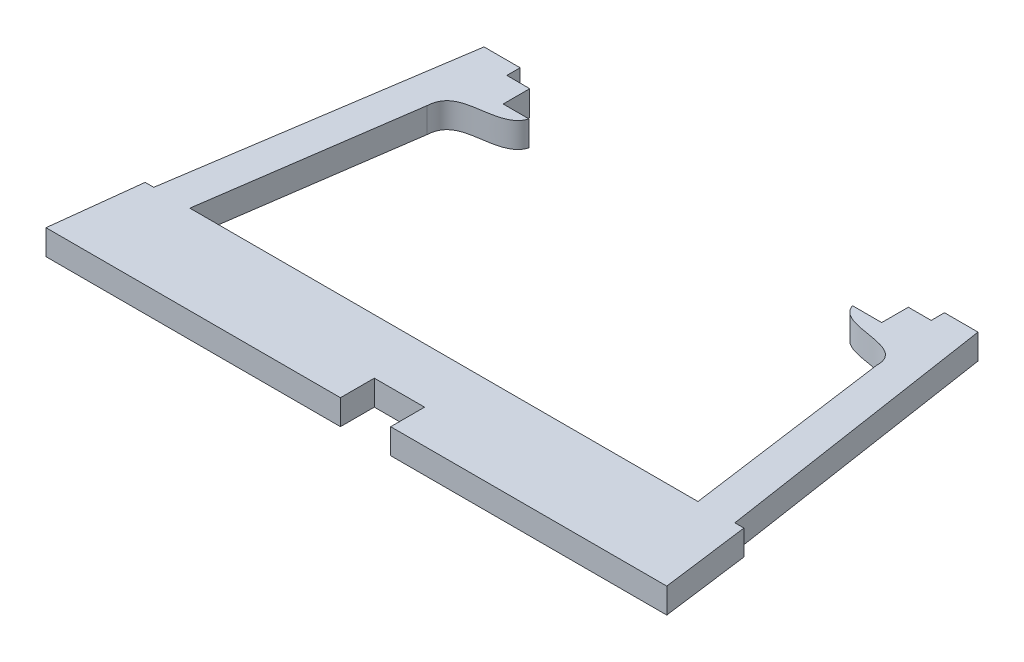
ISO-10303-21;
HEADER;
FILE_DESCRIPTION(('STEP AP214'),'2;1');
FILE_NAME('part.step','',(''),(''),'','','');
FILE_SCHEMA(('AUTOMOTIVE_DESIGN { 1 0 10303 214 1 1 1 1 }'));
ENDSEC;
DATA;
#1=APPLICATION_CONTEXT('core data for automotive mechanical design processes');
#2=APPLICATION_PROTOCOL_DEFINITION('international standard','automotive_design',2000,#1);
#3=PRODUCT_CONTEXT('',#1,'mechanical');
#4=PRODUCT('Part','Part','',(#3));
#5=PRODUCT_RELATED_PRODUCT_CATEGORY('part','',(#4));
#6=PRODUCT_DEFINITION_FORMATION('','',#4);
#7=PRODUCT_DEFINITION_CONTEXT('part definition',#1,'design');
#8=PRODUCT_DEFINITION('design','',#6,#7);
#9=PRODUCT_DEFINITION_SHAPE('','',#8);
#10=(LENGTH_UNIT() NAMED_UNIT(*) SI_UNIT(.MILLI.,.METRE.));
#11=(NAMED_UNIT(*) PLANE_ANGLE_UNIT() SI_UNIT($,.RADIAN.));
#12=(NAMED_UNIT(*) SI_UNIT($,.STERADIAN.) SOLID_ANGLE_UNIT());
#13=UNCERTAINTY_MEASURE_WITH_UNIT(LENGTH_MEASURE(1.E-05),#10,'distance_accuracy_value','');
#14=(GEOMETRIC_REPRESENTATION_CONTEXT(3) GLOBAL_UNCERTAINTY_ASSIGNED_CONTEXT((#13)) GLOBAL_UNIT_ASSIGNED_CONTEXT((#10,
#11,#12)) REPRESENTATION_CONTEXT('',''));
#15=CARTESIAN_POINT('',(0.,0.,0.));
#16=DIRECTION('',(0.,0.,1.));
#17=DIRECTION('',(1.,0.,0.));
#18=AXIS2_PLACEMENT_3D('',#15,#16,#17);
#19=CARTESIAN_POINT('',(-49.4040288484607,4.,126.0149070855));
#20=DIRECTION('',(0.,0.,-1.));
#21=DIRECTION('',(-1.,0.,0.));
#22=AXIS2_PLACEMENT_3D('',#19,#20,#21);
#23=PLANE('',#22);
#24=DIRECTION('',(1.,0.,0.));
#25=VECTOR('',#24,1.);
#26=CARTESIAN_POINT('',(-49.4040288484607,0.,126.0149070855));
#27=LINE('',#26,#25);
#28=CARTESIAN_POINT('',(-93.3560291051147,0.,126.0149070855));
#29=VERTEX_POINT('',#28);
#30=CARTESIAN_POINT('',(-49.4040288484607,0.,126.0149070855));
#31=VERTEX_POINT('',#30);
#32=EDGE_CURVE('E245',#29,#31,#27,.T.);
#33=ORIENTED_EDGE('',*,*,#32,.T.);
#34=DIRECTION('',(0.,-1.,0.));
#35=VECTOR('',#34,1.);
#36=CARTESIAN_POINT('',(-49.4040288484607,4.,126.0149070855));
#37=LINE('',#36,#35);
#38=CARTESIAN_POINT('',(-49.4040288484607,4.,126.0149070855));
#39=VERTEX_POINT('',#38);
#40=EDGE_CURVE('E11',#39,#31,#37,.T.);
#41=ORIENTED_EDGE('',*,*,#40,.F.);
#42=DIRECTION('',(1.,0.,0.));
#43=VECTOR('',#42,1.);
#44=CARTESIAN_POINT('',(-49.4040288484607,4.,126.0149070855));
#45=LINE('',#44,#43);
#46=CARTESIAN_POINT('',(-93.3560291051147,4.,126.0149070855));
#47=VERTEX_POINT('',#46);
#48=EDGE_CURVE('E305',#47,#39,#45,.T.);
#49=ORIENTED_EDGE('',*,*,#48,.F.);
#50=DIRECTION('',(0.,-1.,0.));
#51=VECTOR('',#50,1.);
#52=CARTESIAN_POINT('',(-93.3560291051147,4.,126.0149070855));
#53=LINE('',#52,#51);
#54=EDGE_CURVE('E241',#47,#29,#53,.T.);
#55=ORIENTED_EDGE('',*,*,#54,.T.);
#56=EDGE_LOOP('',(#33,#41,#49,#55));
#57=FACE_BOUND('',#56,.T.);
#58=ADVANCED_FACE('F41',(#57),#23,.F.);
#59=CARTESIAN_POINT('',(-49.4040288484607,4.,126.0149070855));
#60=DIRECTION('',(-0.991434076940235,0.,0.130608081992133));
#61=DIRECTION('',(0.130608081992133,0.,0.991434076940235));
#62=AXIS2_PLACEMENT_3D('',#59,#60,#61);
#63=PLANE('',#62);
#64=DIRECTION('',(-0.130608081992133,0.,-0.991434076940235));
#65=VECTOR('',#64,1.);
#66=CARTESIAN_POINT('',(-49.4040288484607,0.,126.0149070855));
#67=LINE('',#66,#65);
#68=CARTESIAN_POINT('',(-51.2673625897512,0.,111.870510049341));
#69=VERTEX_POINT('',#68);
#70=EDGE_CURVE('E248',#31,#69,#67,.T.);
#71=ORIENTED_EDGE('',*,*,#70,.T.);
#72=DIRECTION('',(0.,-1.,0.));
#73=VECTOR('',#72,1.);
#74=CARTESIAN_POINT('',(-51.2673625897512,4.,111.870510049341));
#75=LINE('',#74,#73);
#76=CARTESIAN_POINT('',(-51.2673625897512,4.,111.870510049341));
#77=VERTEX_POINT('',#76);
#78=EDGE_CURVE('E49',#77,#69,#75,.T.);
#79=ORIENTED_EDGE('',*,*,#78,.F.);
#80=DIRECTION('',(-0.130608081992133,0.,-0.991434076940235));
#81=VECTOR('',#80,1.);
#82=CARTESIAN_POINT('',(-49.4040288484607,4.,126.0149070855));
#83=LINE('',#82,#81);
#84=EDGE_CURVE('E154',#39,#77,#83,.T.);
#85=ORIENTED_EDGE('',*,*,#84,.F.);
#86=ORIENTED_EDGE('',*,*,#40,.T.);
#87=EDGE_LOOP('',(#71,#79,#85,#86));
#88=FACE_BOUND('',#87,.T.);
#89=ADVANCED_FACE('F443',(#88),#63,.F.);
#90=CARTESIAN_POINT('',(-51.2673625897512,4.,111.870510049341));
#91=DIRECTION('',(0.,0.,1.));
#92=DIRECTION('',(1.,0.,0.));
#93=AXIS2_PLACEMENT_3D('',#90,#91,#92);
#94=PLANE('',#93);
#95=DIRECTION('',(-1.,0.,0.));
#96=VECTOR('',#95,1.);
#97=CARTESIAN_POINT('',(-51.2673625897512,0.,111.870510049341));
#98=LINE('',#97,#96);
#99=CARTESIAN_POINT('',(-52.7072113898393,0.,111.870510049341));
#100=VERTEX_POINT('',#99);
#101=EDGE_CURVE('E250',#69,#100,#98,.T.);
#102=ORIENTED_EDGE('',*,*,#101,.T.);
#103=DIRECTION('',(0.,-1.,0.));
#104=VECTOR('',#103,1.);
#105=CARTESIAN_POINT('',(-52.7072113898393,4.,111.870510049341));
#106=LINE('',#105,#104);
#107=CARTESIAN_POINT('',(-52.7072113898393,4.,111.870510049341));
#108=VERTEX_POINT('',#107);
#109=EDGE_CURVE('E366',#108,#100,#106,.T.);
#110=ORIENTED_EDGE('',*,*,#109,.F.);
#111=DIRECTION('',(-1.,0.,0.));
#112=VECTOR('',#111,1.);
#113=CARTESIAN_POINT('',(-51.2673625897512,4.,111.870510049341));
#114=LINE('',#113,#112);
#115=EDGE_CURVE('E374',#77,#108,#114,.T.);
#116=ORIENTED_EDGE('',*,*,#115,.F.);
#117=ORIENTED_EDGE('',*,*,#78,.T.);
#118=EDGE_LOOP('',(#102,#110,#116,#117));
#119=FACE_BOUND('',#118,.T.);
#120=ADVANCED_FACE('F372',(#119),#94,.F.);
#121=CARTESIAN_POINT('',(-52.7072113898393,4.,111.870510049341));
#122=DIRECTION('',(-0.988624766956108,0.,0.150403025770695));
#123=DIRECTION('',(0.150403025770695,0.,0.988624766956108));
#124=AXIS2_PLACEMENT_3D('',#121,#122,#123);
#125=PLANE('',#124);
#126=DIRECTION('',(-0.150403025770695,0.,-0.988624766956108));
#127=VECTOR('',#126,1.);
#128=CARTESIAN_POINT('',(-52.7072113898393,0.,111.870510049341));
#129=LINE('',#128,#127);
#130=CARTESIAN_POINT('',(-59.6523644255584,0.,66.2188333877263));
#131=VERTEX_POINT('',#130);
#132=EDGE_CURVE('E252',#100,#131,#129,.T.);
#133=ORIENTED_EDGE('',*,*,#132,.T.);
#134=DIRECTION('',(0.,-1.,0.));
#135=VECTOR('',#134,1.);
#136=CARTESIAN_POINT('',(-59.6523644255584,4.,66.2188333877263));
#137=LINE('',#136,#135);
#138=CARTESIAN_POINT('',(-59.6523644255584,4.,66.2188333877263));
#139=VERTEX_POINT('',#138);
#140=EDGE_CURVE('E363',#139,#131,#137,.T.);
#141=ORIENTED_EDGE('',*,*,#140,.F.);
#142=DIRECTION('',(-0.150403025770695,0.,-0.988624766956108));
#143=VECTOR('',#142,1.);
#144=CARTESIAN_POINT('',(-52.7072113898393,4.,111.870510049341));
#145=LINE('',#144,#143);
#146=EDGE_CURVE('E392',#108,#139,#145,.T.);
#147=ORIENTED_EDGE('',*,*,#146,.F.);
#148=ORIENTED_EDGE('',*,*,#109,.T.);
#149=EDGE_LOOP('',(#133,#141,#147,#148));
#150=FACE_BOUND('',#149,.T.);
#151=ADVANCED_FACE('F383',(#150),#125,.F.);
#152=CARTESIAN_POINT('',(-59.6523644255584,4.,66.2188333877263));
#153=DIRECTION('',(0.,0.,1.));
#154=DIRECTION('',(1.,0.,0.));
#155=AXIS2_PLACEMENT_3D('',#152,#153,#154);
#156=PLANE('',#155);
#157=DIRECTION('',(-1.,0.,0.));
#158=VECTOR('',#157,1.);
#159=CARTESIAN_POINT('',(-59.6523644255584,0.,66.2188333877263));
#160=LINE('',#159,#158);
#161=CARTESIAN_POINT('',(-64.9882746847082,0.,66.2188333877263));
#162=VERTEX_POINT('',#161);
#163=EDGE_CURVE('E254',#131,#162,#160,.T.);
#164=ORIENTED_EDGE('',*,*,#163,.T.);
#165=DIRECTION('',(0.,-1.,0.));
#166=VECTOR('',#165,1.);
#167=CARTESIAN_POINT('',(-64.9882746847082,4.,66.2188333877263));
#168=LINE('',#167,#166);
#169=CARTESIAN_POINT('',(-64.9882746847082,4.,66.2188333877263));
#170=VERTEX_POINT('',#169);
#171=EDGE_CURVE('E360',#170,#162,#168,.T.);
#172=ORIENTED_EDGE('',*,*,#171,.F.);
#173=DIRECTION('',(-1.,0.,0.));
#174=VECTOR('',#173,1.);
#175=CARTESIAN_POINT('',(-59.6523644255584,4.,66.2188333877263));
#176=LINE('',#175,#174);
#177=EDGE_CURVE('E389',#139,#170,#176,.T.);
#178=ORIENTED_EDGE('',*,*,#177,.F.);
#179=ORIENTED_EDGE('',*,*,#140,.T.);
#180=EDGE_LOOP('',(#164,#172,#178,#179));
#181=FACE_BOUND('',#180,.T.);
#182=ADVANCED_FACE('F387',(#181),#156,.F.);
#183=CARTESIAN_POINT('',(-64.9882746847082,4.,66.2188333877263));
#184=DIRECTION('',(1.,0.,0.));
#185=DIRECTION('',(0.,0.,-1.));
#186=AXIS2_PLACEMENT_3D('',#183,#184,#185);
#187=PLANE('',#186);
#188=DIRECTION('',(0.,0.,1.));
#189=VECTOR('',#188,1.);
#190=CARTESIAN_POINT('',(-64.9882746847082,0.,66.2188333877263));
#191=LINE('',#190,#189);
#192=CARTESIAN_POINT('',(-64.9882746847082,0.,68.3362580937382));
#193=VERTEX_POINT('',#192);
#194=EDGE_CURVE('E256',#162,#193,#191,.T.);
#195=ORIENTED_EDGE('',*,*,#194,.T.);
#196=DIRECTION('',(0.,-1.,0.));
#197=VECTOR('',#196,1.);
#198=CARTESIAN_POINT('',(-64.9882746847082,4.,68.3362580937382));
#199=LINE('',#198,#197);
#200=CARTESIAN_POINT('',(-64.9882746847082,4.,68.3362580937382));
#201=VERTEX_POINT('',#200);
#202=EDGE_CURVE('E357',#201,#193,#199,.T.);
#203=ORIENTED_EDGE('',*,*,#202,.F.);
#204=DIRECTION('',(0.,0.,1.));
#205=VECTOR('',#204,1.);
#206=CARTESIAN_POINT('',(-64.9882746847082,4.,66.2188333877263));
#207=LINE('',#206,#205);
#208=EDGE_CURVE('E391',#170,#201,#207,.T.);
#209=ORIENTED_EDGE('',*,*,#208,.F.);
#210=ORIENTED_EDGE('',*,*,#171,.T.);
#211=EDGE_LOOP('',(#195,#203,#209,#210));
#212=FACE_BOUND('',#211,.T.);
#213=ADVANCED_FACE('F433',(#212),#187,.F.);
#214=CARTESIAN_POINT('',(-64.9882746847082,4.,68.3362580937382));
#215=DIRECTION('',(0.,0.,1.));
#216=DIRECTION('',(1.,0.,0.));
#217=AXIS2_PLACEMENT_3D('',#214,#215,#216);
#218=PLANE('',#217);
#219=DIRECTION('',(-1.,0.,0.));
#220=VECTOR('',#219,1.);
#221=CARTESIAN_POINT('',(-64.9882746847082,0.,68.3362580937382));
#222=LINE('',#221,#220);
#223=CARTESIAN_POINT('',(-68.6302451790486,0.,68.3362580937382));
#224=VERTEX_POINT('',#223);
#225=EDGE_CURVE('E258',#193,#224,#222,.T.);
#226=ORIENTED_EDGE('',*,*,#225,.T.);
#227=DIRECTION('',(0.,-1.,0.));
#228=VECTOR('',#227,1.);
#229=CARTESIAN_POINT('',(-68.6302451790486,4.,68.3362580937382));
#230=LINE('',#229,#228);
#231=CARTESIAN_POINT('',(-68.6302451790486,4.,68.3362580937382));
#232=VERTEX_POINT('',#231);
#233=EDGE_CURVE('E354',#232,#224,#230,.T.);
#234=ORIENTED_EDGE('',*,*,#233,.F.);
#235=DIRECTION('',(-1.,0.,0.));
#236=VECTOR('',#235,1.);
#237=CARTESIAN_POINT('',(-64.9882746847082,4.,68.3362580937382));
#238=LINE('',#237,#236);
#239=EDGE_CURVE('E394',#201,#232,#238,.T.);
#240=ORIENTED_EDGE('',*,*,#239,.F.);
#241=ORIENTED_EDGE('',*,*,#202,.T.);
#242=EDGE_LOOP('',(#226,#234,#240,#241));
#243=FACE_BOUND('',#242,.T.);
#244=ADVANCED_FACE('F429',(#243),#218,.F.);
#245=CARTESIAN_POINT('',(-68.6302451790486,4.,68.3362580937382));
#246=DIRECTION('',(1.,0.,0.));
#247=DIRECTION('',(0.,0.,-1.));
#248=AXIS2_PLACEMENT_3D('',#245,#246,#247);
#249=PLANE('',#248);
#250=DIRECTION('',(0.,0.,1.));
#251=VECTOR('',#250,1.);
#252=CARTESIAN_POINT('',(-68.6302451790486,0.,68.3362580937382));
#253=LINE('',#252,#251);
#254=CARTESIAN_POINT('',(-68.6302451790485,0.,72.5711075057618));
#255=VERTEX_POINT('',#254);
#256=EDGE_CURVE('E260',#224,#255,#253,.T.);
#257=ORIENTED_EDGE('',*,*,#256,.T.);
#258=DIRECTION('',(0.,-1.,0.));
#259=VECTOR('',#258,1.);
#260=CARTESIAN_POINT('',(-68.6302451790485,4.,72.5711075057618));
#261=LINE('',#260,#259);
#262=CARTESIAN_POINT('',(-68.6302451790485,4.,72.5711075057618));
#263=VERTEX_POINT('',#262);
#264=EDGE_CURVE('E351',#263,#255,#261,.T.);
#265=ORIENTED_EDGE('',*,*,#264,.F.);
#266=DIRECTION('',(0.,0.,1.));
#267=VECTOR('',#266,1.);
#268=CARTESIAN_POINT('',(-68.6302451790486,4.,68.3362580937382));
#269=LINE('',#268,#267);
#270=EDGE_CURVE('E400',#232,#263,#269,.T.);
#271=ORIENTED_EDGE('',*,*,#270,.F.);
#272=ORIENTED_EDGE('',*,*,#233,.T.);
#273=EDGE_LOOP('',(#257,#265,#271,#272));
#274=FACE_BOUND('',#273,.T.);
#275=ADVANCED_FACE('F425',(#274),#249,.F.);
#276=CARTESIAN_POINT('',(-68.6302451790485,4.,72.5711075057618));
#277=DIRECTION('',(0.,0.,1.));
#278=DIRECTION('',(1.,0.,0.));
#279=AXIS2_PLACEMENT_3D('',#276,#277,#278);
#280=PLANE('',#279);
#281=DIRECTION('',(-1.,0.,0.));
#282=VECTOR('',#281,1.);
#283=CARTESIAN_POINT('',(-68.6302451790485,0.,72.5711075057618));
#284=LINE('',#283,#282);
#285=CARTESIAN_POINT('',(-73.2885795322746,0.,72.5711075057619));
#286=VERTEX_POINT('',#285);
#287=EDGE_CURVE('E262',#255,#286,#284,.T.);
#288=ORIENTED_EDGE('',*,*,#287,.T.);
#289=DIRECTION('',(0.,-1.,0.));
#290=VECTOR('',#289,1.);
#291=CARTESIAN_POINT('',(-73.2885795322746,4.,72.5711075057619));
#292=LINE('',#291,#290);
#293=CARTESIAN_POINT('',(-73.2885795322746,4.,72.5711075057619));
#294=VERTEX_POINT('',#293);
#295=EDGE_CURVE('E348',#294,#286,#292,.T.);
#296=ORIENTED_EDGE('',*,*,#295,.F.);
#297=DIRECTION('',(-1.,0.,0.));
#298=VECTOR('',#297,1.);
#299=CARTESIAN_POINT('',(-68.6302451790485,4.,72.5711075057618));
#300=LINE('',#299,#298);
#301=EDGE_CURVE('E402',#263,#294,#300,.T.);
#302=ORIENTED_EDGE('',*,*,#301,.F.);
#303=ORIENTED_EDGE('',*,*,#264,.T.);
#304=EDGE_LOOP('',(#288,#296,#302,#303));
#305=FACE_BOUND('',#304,.T.);
#306=ADVANCED_FACE('F420',(#305),#280,.F.);
#307=CARTESIAN_POINT('',(-73.2885795322746,4.,72.5711075057619));
#308=CARTESIAN_POINT('',(-71.9075257445116,4.,76.7032181711937));
#309=CARTESIAN_POINT('',(-62.9924358682695,4.,73.6628925614563));
#310=CARTESIAN_POINT('',(-63.1433697668413,4.,78.8627978108118));
#311=B_SPLINE_CURVE_WITH_KNOTS('',3,(#307,#308,#309,#310),.UNSPECIFIED.,.F.,.F.,(4,4),(0.,1.),.UNSPECIFIED.);
#312=DIRECTION('',(0.,-1.,0.));
#313=VECTOR('',#312,1.);
#314=SURFACE_OF_LINEAR_EXTRUSION('',#311,#313);
#315=CARTESIAN_POINT('',(-73.2885795322746,0.,72.5711075057619));
#316=CARTESIAN_POINT('',(-71.9075257445116,0.,76.7032181711937));
#317=CARTESIAN_POINT('',(-62.9924358682695,0.,73.6628925614563));
#318=CARTESIAN_POINT('',(-63.1433697668413,0.,78.8627978108118));
#319=B_SPLINE_CURVE_WITH_KNOTS('',3,(#315,#316,#317,#318),.UNSPECIFIED.,.F.,.F.,(4,4),(0.,1.),.UNSPECIFIED.);
#320=CARTESIAN_POINT('',(-63.1433697668413,0.,78.8627978108118));
#321=VERTEX_POINT('',#320);
#322=EDGE_CURVE('E264',#286,#321,#319,.T.);
#323=ORIENTED_EDGE('',*,*,#322,.T.);
#324=DIRECTION('',(0.,-1.,0.));
#325=VECTOR('',#324,1.);
#326=CARTESIAN_POINT('',(-63.1433697668413,4.,78.8627978108118));
#327=LINE('',#326,#325);
#328=CARTESIAN_POINT('',(-63.1433697668413,4.,78.8627978108118));
#329=VERTEX_POINT('',#328);
#330=EDGE_CURVE('E345',#329,#321,#327,.T.);
#331=ORIENTED_EDGE('',*,*,#330,.F.);
#332=EDGE_CURVE('E404',#294,#329,#311,.T.);
#333=ORIENTED_EDGE('',*,*,#332,.F.);
#334=ORIENTED_EDGE('',*,*,#295,.T.);
#335=EDGE_LOOP('',(#323,#331,#333,#334));
#336=FACE_BOUND('',#335,.T.);
#337=ADVANCED_FACE('F415',(#336),#314,.F.);
#338=CARTESIAN_POINT('',(-58.58338655225,4.,111.870510049341));
#339=DIRECTION('',(0.990591878074108,0.,-0.136849300669063));
#340=DIRECTION('',(-0.136849300669063,0.,-0.990591878074108));
#341=AXIS2_PLACEMENT_3D('',#338,#339,#340);
#342=PLANE('',#341);
#343=DIRECTION('',(0.136849300669063,0.,0.990591878074108));
#344=VECTOR('',#343,1.);
#345=CARTESIAN_POINT('',(-58.58338655225,0.,111.870510049341));
#346=LINE('',#345,#344);
#347=CARTESIAN_POINT('',(-58.58338655225,0.,111.870510049341));
#348=VERTEX_POINT('',#347);
#349=EDGE_CURVE('E268',#321,#348,#346,.T.);
#350=ORIENTED_EDGE('',*,*,#349,.T.);
#351=DIRECTION('',(0.,-1.,0.));
#352=VECTOR('',#351,1.);
#353=CARTESIAN_POINT('',(-58.58338655225,4.,111.870510049341));
#354=LINE('',#353,#352);
#355=CARTESIAN_POINT('',(-58.58338655225,4.,111.870510049341));
#356=VERTEX_POINT('',#355);
#357=EDGE_CURVE('E342',#356,#348,#354,.T.);
#358=ORIENTED_EDGE('',*,*,#357,.F.);
#359=DIRECTION('',(0.136849300669063,0.,0.990591878074108));
#360=VECTOR('',#359,1.);
#361=CARTESIAN_POINT('',(-58.58338655225,4.,111.870510049341));
#362=LINE('',#361,#360);
#363=EDGE_CURVE('E409',#329,#356,#362,.T.);
#364=ORIENTED_EDGE('',*,*,#363,.F.);
#365=ORIENTED_EDGE('',*,*,#330,.T.);
#366=EDGE_LOOP('',(#350,#358,#364,#365));
#367=FACE_BOUND('',#366,.T.);
#368=ADVANCED_FACE('F419',(#367),#342,.F.);
#369=CARTESIAN_POINT('',(-139.477488779097,4.,111.870510049342));
#370=DIRECTION('',(0.,0.,1.));
#371=DIRECTION('',(1.,0.,0.));
#372=AXIS2_PLACEMENT_3D('',#369,#370,#371);
#373=PLANE('',#372);
#374=DIRECTION('',(-1.,0.,0.));
#375=VECTOR('',#374,1.);
#376=CARTESIAN_POINT('',(-139.477488779097,0.,111.870510049342));
#377=LINE('',#376,#375);
#378=CARTESIAN_POINT('',(-139.477488779097,0.,111.870510049342));
#379=VERTEX_POINT('',#378);
#380=EDGE_CURVE('E273',#348,#379,#377,.T.);
#381=ORIENTED_EDGE('',*,*,#380,.T.);
#382=DIRECTION('',(0.,-1.,0.));
#383=VECTOR('',#382,1.);
#384=CARTESIAN_POINT('',(-139.477488779097,4.,111.870510049342));
#385=LINE('',#384,#383);
#386=CARTESIAN_POINT('',(-139.477488779097,4.,111.870510049342));
#387=VERTEX_POINT('',#386);
#388=EDGE_CURVE('E339',#387,#379,#385,.T.);
#389=ORIENTED_EDGE('',*,*,#388,.F.);
#390=DIRECTION('',(-1.,0.,0.));
#391=VECTOR('',#390,1.);
#392=CARTESIAN_POINT('',(-139.477488779097,4.,111.870510049342));
#393=LINE('',#392,#391);
#394=EDGE_CURVE('E519',#356,#387,#393,.T.);
#395=ORIENTED_EDGE('',*,*,#394,.F.);
#396=ORIENTED_EDGE('',*,*,#357,.T.);
#397=EDGE_LOOP('',(#381,#389,#395,#396));
#398=FACE_BOUND('',#397,.T.);
#399=ADVANCED_FACE('F518',(#398),#373,.F.);
#400=CARTESIAN_POINT('',(-134.735106235922,4.,78.8627978108123));
#401=DIRECTION('',(-0.989835841721892,0.,-0.142214649184649));
#402=DIRECTION('',(-0.142214649184649,0.,0.989835841721892));
#403=AXIS2_PLACEMENT_3D('',#400,#401,#402);
#404=PLANE('',#403);
#405=DIRECTION('',(0.142214649184649,0.,-0.989835841721892));
#406=VECTOR('',#405,1.);
#407=CARTESIAN_POINT('',(-134.735106235922,0.,78.8627978108123));
#408=LINE('',#407,#406);
#409=CARTESIAN_POINT('',(-134.735106235922,0.,78.8627978108123));
#410=VERTEX_POINT('',#409);
#411=EDGE_CURVE('E275',#379,#410,#408,.T.);
#412=ORIENTED_EDGE('',*,*,#411,.T.);
#413=DIRECTION('',(0.,-1.,0.));
#414=VECTOR('',#413,1.);
#415=CARTESIAN_POINT('',(-134.735106235922,4.,78.8627978108123));
#416=LINE('',#415,#414);
#417=CARTESIAN_POINT('',(-134.735106235922,4.,78.8627978108123));
#418=VERTEX_POINT('',#417);
#419=EDGE_CURVE('E336',#418,#410,#416,.T.);
#420=ORIENTED_EDGE('',*,*,#419,.F.);
#421=DIRECTION('',(0.142214649184649,0.,-0.989835841721892));
#422=VECTOR('',#421,1.);
#423=CARTESIAN_POINT('',(-134.735106235922,4.,78.8627978108123));
#424=LINE('',#423,#422);
#425=EDGE_CURVE('E514',#387,#418,#424,.T.);
#426=ORIENTED_EDGE('',*,*,#425,.F.);
#427=ORIENTED_EDGE('',*,*,#388,.T.);
#428=EDGE_LOOP('',(#412,#420,#426,#427));
#429=FACE_BOUND('',#428,.T.);
#430=ADVANCED_FACE('F513',(#429),#404,.F.);
#431=CARTESIAN_POINT('',(-134.735106235922,4.,78.8627978108123));
#432=CARTESIAN_POINT('',(-134.529259995621,4.,75.5671750362815));
#433=CARTESIAN_POINT('',(-129.876755781231,4.,75.4777609406573));
#434=CARTESIAN_POINT('',(-125.277958036841,4.,74.2327659482103));
#435=CARTESIAN_POINT('',(-124.794342828113,4.,72.5711075057622));
#436=B_SPLINE_CURVE_WITH_KNOTS('',3,(#431,#432,#433,#434,#435),.UNSPECIFIED.,.F.,.F.,(4,1,4),
(0.,0.60727925442209,1.),.UNSPECIFIED.);
#437=DIRECTION('',(0.,-1.,0.));
#438=VECTOR('',#437,1.);
#439=SURFACE_OF_LINEAR_EXTRUSION('',#436,#438);
#440=CARTESIAN_POINT('',(-134.735106235922,0.,78.8627978108123));
#441=CARTESIAN_POINT('',(-134.529259995621,0.,75.5671750362815));
#442=CARTESIAN_POINT('',(-129.876755781231,0.,75.4777609406573));
#443=CARTESIAN_POINT('',(-125.277958036841,0.,74.2327659482103));
#444=CARTESIAN_POINT('',(-124.794342828113,0.,72.5711075057622));
#445=B_SPLINE_CURVE_WITH_KNOTS('',3,(#440,#441,#442,#443,#444),.UNSPECIFIED.,.F.,.F.,(4,1,4),
(0.,0.60727925442209,1.),.UNSPECIFIED.);
#446=CARTESIAN_POINT('',(-124.794342828113,0.,72.5711075057622));
#447=VERTEX_POINT('',#446);
#448=EDGE_CURVE('E277',#410,#447,#445,.T.);
#449=ORIENTED_EDGE('',*,*,#448,.T.);
#450=DIRECTION('',(0.,-1.,0.));
#451=VECTOR('',#450,1.);
#452=CARTESIAN_POINT('',(-124.794342828113,4.,72.5711075057622));
#453=LINE('',#452,#451);
#454=CARTESIAN_POINT('',(-124.794342828113,4.,72.5711075057622));
#455=VERTEX_POINT('',#454);
#456=EDGE_CURVE('E333',#455,#447,#453,.T.);
#457=ORIENTED_EDGE('',*,*,#456,.F.);
#458=EDGE_CURVE('E510',#418,#455,#436,.T.);
#459=ORIENTED_EDGE('',*,*,#458,.F.);
#460=ORIENTED_EDGE('',*,*,#419,.T.);
#461=EDGE_LOOP('',(#449,#457,#459,#460));
#462=FACE_BOUND('',#461,.T.);
#463=ADVANCED_FACE('F507',(#462),#439,.F.);
#464=CARTESIAN_POINT('',(-128.898327721245,4.,72.5711075057622));
#465=DIRECTION('',(0.,0.,1.));
#466=DIRECTION('',(1.,0.,0.));
#467=AXIS2_PLACEMENT_3D('',#464,#465,#466);
#468=PLANE('',#467);
#469=DIRECTION('',(-1.,0.,0.));
#470=VECTOR('',#469,1.);
#471=CARTESIAN_POINT('',(-128.898327721245,0.,72.5711075057622));
#472=LINE('',#471,#470);
#473=CARTESIAN_POINT('',(-128.898327721245,0.,72.5711075057622));
#474=VERTEX_POINT('',#473);
#475=EDGE_CURVE('E281',#447,#474,#472,.T.);
#476=ORIENTED_EDGE('',*,*,#475,.T.);
#477=DIRECTION('',(0.,-1.,0.));
#478=VECTOR('',#477,1.);
#479=CARTESIAN_POINT('',(-128.898327721245,4.,72.5711075057622));
#480=LINE('',#479,#478);
#481=CARTESIAN_POINT('',(-128.898327721245,4.,72.5711075057622));
#482=VERTEX_POINT('',#481);
#483=EDGE_CURVE('E330',#482,#474,#480,.T.);
#484=ORIENTED_EDGE('',*,*,#483,.F.);
#485=DIRECTION('',(-1.,0.,0.));
#486=VECTOR('',#485,1.);
#487=CARTESIAN_POINT('',(-128.898327721245,4.,72.5711075057622));
#488=LINE('',#487,#486);
#489=EDGE_CURVE('E501',#455,#482,#488,.T.);
#490=ORIENTED_EDGE('',*,*,#489,.F.);
#491=ORIENTED_EDGE('',*,*,#456,.T.);
#492=EDGE_LOOP('',(#476,#484,#490,#491));
#493=FACE_BOUND('',#492,.T.);
#494=ADVANCED_FACE('F500',(#493),#468,.F.);
#495=CARTESIAN_POINT('',(-128.898327721246,4.,68.3362580937386));
#496=DIRECTION('',(-1.,0.,0.));
#497=DIRECTION('',(0.,0.,1.));
#498=AXIS2_PLACEMENT_3D('',#495,#496,#497);
#499=PLANE('',#498);
#500=DIRECTION('',(0.,0.,-1.));
#501=VECTOR('',#500,1.);
#502=CARTESIAN_POINT('',(-128.898327721246,0.,68.3362580937386));
#503=LINE('',#502,#501);
#504=CARTESIAN_POINT('',(-128.898327721246,0.,68.3362580937386));
#505=VERTEX_POINT('',#504);
#506=EDGE_CURVE('E286',#474,#505,#503,.T.);
#507=ORIENTED_EDGE('',*,*,#506,.T.);
#508=DIRECTION('',(0.,-1.,0.));
#509=VECTOR('',#508,1.);
#510=CARTESIAN_POINT('',(-128.898327721246,4.,68.3362580937386));
#511=LINE('',#510,#509);
#512=CARTESIAN_POINT('',(-128.898327721246,4.,68.3362580937386));
#513=VERTEX_POINT('',#512);
#514=EDGE_CURVE('E327',#513,#505,#511,.T.);
#515=ORIENTED_EDGE('',*,*,#514,.F.);
#516=DIRECTION('',(0.,0.,-1.));
#517=VECTOR('',#516,1.);
#518=CARTESIAN_POINT('',(-128.898327721246,4.,68.3362580937386));
#519=LINE('',#518,#517);
#520=EDGE_CURVE('E496',#482,#513,#519,.T.);
#521=ORIENTED_EDGE('',*,*,#520,.F.);
#522=ORIENTED_EDGE('',*,*,#483,.T.);
#523=EDGE_LOOP('',(#507,#515,#521,#522));
#524=FACE_BOUND('',#523,.T.);
#525=ADVANCED_FACE('F495',(#524),#499,.F.);
#526=CARTESIAN_POINT('',(-132.546314292918,4.,68.3362580937386));
#527=DIRECTION('',(0.,0.,1.));
#528=DIRECTION('',(1.,0.,0.));
#529=AXIS2_PLACEMENT_3D('',#526,#527,#528);
#530=PLANE('',#529);
#531=DIRECTION('',(-1.,0.,0.));
#532=VECTOR('',#531,1.);
#533=CARTESIAN_POINT('',(-132.546314292918,0.,68.3362580937386));
#534=LINE('',#533,#532);
#535=CARTESIAN_POINT('',(-132.546314292918,0.,68.3362580937386));
#536=VERTEX_POINT('',#535);
#537=EDGE_CURVE('E288',#505,#536,#534,.T.);
#538=ORIENTED_EDGE('',*,*,#537,.T.);
#539=DIRECTION('',(0.,-1.,0.));
#540=VECTOR('',#539,1.);
#541=CARTESIAN_POINT('',(-132.546314292918,4.,68.3362580937386));
#542=LINE('',#541,#540);
#543=CARTESIAN_POINT('',(-132.546314292918,4.,68.3362580937386));
#544=VERTEX_POINT('',#543);
#545=EDGE_CURVE('E324',#544,#536,#542,.T.);
#546=ORIENTED_EDGE('',*,*,#545,.F.);
#547=DIRECTION('',(-1.,0.,0.));
#548=VECTOR('',#547,1.);
#549=CARTESIAN_POINT('',(-132.546314292918,4.,68.3362580937386));
#550=LINE('',#549,#548);
#551=EDGE_CURVE('E492',#513,#544,#550,.T.);
#552=ORIENTED_EDGE('',*,*,#551,.F.);
#553=ORIENTED_EDGE('',*,*,#514,.T.);
#554=EDGE_LOOP('',(#538,#546,#552,#553));
#555=FACE_BOUND('',#554,.T.);
#556=ADVANCED_FACE('F489',(#555),#530,.F.);
#557=CARTESIAN_POINT('',(-132.546314292918,4.,66.2188333877268));
#558=DIRECTION('',(-1.,0.,0.));
#559=DIRECTION('',(0.,0.,1.));
#560=AXIS2_PLACEMENT_3D('',#557,#558,#559);
#561=PLANE('',#560);
#562=DIRECTION('',(0.,0.,-1.));
#563=VECTOR('',#562,1.);
#564=CARTESIAN_POINT('',(-132.546314292918,0.,66.2188333877268));
#565=LINE('',#564,#563);
#566=CARTESIAN_POINT('',(-132.546314292918,0.,66.2188333877268));
#567=VERTEX_POINT('',#566);
#568=EDGE_CURVE('E290',#536,#567,#565,.T.);
#569=ORIENTED_EDGE('',*,*,#568,.T.);
#570=DIRECTION('',(0.,-1.,0.));
#571=VECTOR('',#570,1.);
#572=CARTESIAN_POINT('',(-132.546314292918,4.,66.2188333877268));
#573=LINE('',#572,#571);
#574=CARTESIAN_POINT('',(-132.546314292918,4.,66.2188333877268));
#575=VERTEX_POINT('',#574);
#576=EDGE_CURVE('E321',#575,#567,#573,.T.);
#577=ORIENTED_EDGE('',*,*,#576,.F.);
#578=DIRECTION('',(0.,0.,-1.));
#579=VECTOR('',#578,1.);
#580=CARTESIAN_POINT('',(-132.546314292918,4.,66.2188333877268));
#581=LINE('',#580,#579);
#582=EDGE_CURVE('E483',#544,#575,#581,.T.);
#583=ORIENTED_EDGE('',*,*,#582,.F.);
#584=ORIENTED_EDGE('',*,*,#545,.T.);
#585=EDGE_LOOP('',(#569,#577,#583,#584));
#586=FACE_BOUND('',#585,.T.);
#587=ADVANCED_FACE('F482',(#586),#561,.F.);
#588=CARTESIAN_POINT('',(-138.291893143303,4.,66.2188333877268));
#589=DIRECTION('',(0.,0.,1.));
#590=DIRECTION('',(1.,0.,0.));
#591=AXIS2_PLACEMENT_3D('',#588,#589,#590);
#592=PLANE('',#591);
#593=DIRECTION('',(-1.,0.,0.));
#594=VECTOR('',#593,1.);
#595=CARTESIAN_POINT('',(-138.291893143303,0.,66.2188333877268));
#596=LINE('',#595,#594);
#597=CARTESIAN_POINT('',(-138.291893143303,0.,66.2188333877268));
#598=VERTEX_POINT('',#597);
#599=EDGE_CURVE('E292',#567,#598,#596,.T.);
#600=ORIENTED_EDGE('',*,*,#599,.T.);
#601=DIRECTION('',(0.,-1.,0.));
#602=VECTOR('',#601,1.);
#603=CARTESIAN_POINT('',(-138.291893143303,4.,66.2188333877268));
#604=LINE('',#603,#602);
#605=CARTESIAN_POINT('',(-138.291893143303,4.,66.2188333877268));
#606=VERTEX_POINT('',#605);
#607=EDGE_CURVE('E318',#606,#598,#604,.T.);
#608=ORIENTED_EDGE('',*,*,#607,.F.);
#609=DIRECTION('',(-1.,0.,0.));
#610=VECTOR('',#609,1.);
#611=CARTESIAN_POINT('',(-138.291893143303,4.,66.2188333877268));
#612=LINE('',#611,#610);
#613=EDGE_CURVE('E478',#575,#606,#612,.T.);
#614=ORIENTED_EDGE('',*,*,#613,.F.);
#615=ORIENTED_EDGE('',*,*,#576,.T.);
#616=EDGE_LOOP('',(#600,#608,#614,#615));
#617=FACE_BOUND('',#616,.T.);
#618=ADVANCED_FACE('F477',(#617),#592,.F.);
#619=CARTESIAN_POINT('',(-145.223067629481,4.,111.870510049342));
#620=DIRECTION('',(0.988669736375541,0.,0.150107136323089));
#621=DIRECTION('',(0.150107136323089,0.,-0.988669736375541));
#622=AXIS2_PLACEMENT_3D('',#619,#620,#621);
#623=PLANE('',#622);
#624=DIRECTION('',(-0.150107136323089,0.,0.988669736375541));
#625=VECTOR('',#624,1.);
#626=CARTESIAN_POINT('',(-145.223067629481,0.,111.870510049342));
#627=LINE('',#626,#625);
#628=CARTESIAN_POINT('',(-145.223067629481,0.,111.870510049342));
#629=VERTEX_POINT('',#628);
#630=EDGE_CURVE('E294',#598,#629,#627,.T.);
#631=ORIENTED_EDGE('',*,*,#630,.T.);
#632=DIRECTION('',(0.,-1.,0.));
#633=VECTOR('',#632,1.);
#634=CARTESIAN_POINT('',(-145.223067629481,4.,111.870510049342));
#635=LINE('',#634,#633);
#636=CARTESIAN_POINT('',(-145.223067629481,4.,111.870510049342));
#637=VERTEX_POINT('',#636);
#638=EDGE_CURVE('E315',#637,#629,#635,.T.);
#639=ORIENTED_EDGE('',*,*,#638,.F.);
#640=DIRECTION('',(-0.150107136323089,0.,0.988669736375541));
#641=VECTOR('',#640,1.);
#642=CARTESIAN_POINT('',(-145.223067629481,4.,111.870510049342));
#643=LINE('',#642,#641);
#644=EDGE_CURVE('E474',#606,#637,#643,.T.);
#645=ORIENTED_EDGE('',*,*,#644,.F.);
#646=ORIENTED_EDGE('',*,*,#607,.T.);
#647=EDGE_LOOP('',(#631,#639,#645,#646));
#648=FACE_BOUND('',#647,.T.);
#649=ADVANCED_FACE('F471',(#648),#623,.F.);
#650=CARTESIAN_POINT('',(-146.591062593859,4.,111.870510049342));
#651=DIRECTION('',(0.,0.,1.));
#652=DIRECTION('',(1.,0.,0.));
#653=AXIS2_PLACEMENT_3D('',#650,#651,#652);
#654=PLANE('',#653);
#655=DIRECTION('',(-1.,0.,0.));
#656=VECTOR('',#655,1.);
#657=CARTESIAN_POINT('',(-146.591062593859,0.,111.870510049342));
#658=LINE('',#657,#656);
#659=CARTESIAN_POINT('',(-146.591062593859,0.,111.870510049342));
#660=VERTEX_POINT('',#659);
#661=EDGE_CURVE('E296',#629,#660,#658,.T.);
#662=ORIENTED_EDGE('',*,*,#661,.T.);
#663=DIRECTION('',(0.,-1.,0.));
#664=VECTOR('',#663,1.);
#665=CARTESIAN_POINT('',(-146.591062593859,4.,111.870510049342));
#666=LINE('',#665,#664);
#667=CARTESIAN_POINT('',(-146.591062593859,4.,111.870510049342));
#668=VERTEX_POINT('',#667);
#669=EDGE_CURVE('E312',#668,#660,#666,.T.);
#670=ORIENTED_EDGE('',*,*,#669,.F.);
#671=DIRECTION('',(-1.,0.,0.));
#672=VECTOR('',#671,1.);
#673=CARTESIAN_POINT('',(-146.591062593859,4.,111.870510049342));
#674=LINE('',#673,#672);
#675=EDGE_CURVE('E465',#637,#668,#674,.T.);
#676=ORIENTED_EDGE('',*,*,#675,.F.);
#677=ORIENTED_EDGE('',*,*,#638,.T.);
#678=EDGE_LOOP('',(#662,#670,#676,#677));
#679=FACE_BOUND('',#678,.T.);
#680=ADVANCED_FACE('F464',(#679),#654,.F.);
#681=CARTESIAN_POINT('',(-148.232656551111,4.,126.014907085501));
#682=DIRECTION('',(0.993332361223321,0.,0.115285819364313));
#683=DIRECTION('',(0.115285819364313,0.,-0.993332361223321));
#684=AXIS2_PLACEMENT_3D('',#681,#682,#683);
#685=PLANE('',#684);
#686=DIRECTION('',(-0.115285819364313,0.,0.993332361223321));
#687=VECTOR('',#686,1.);
#688=CARTESIAN_POINT('',(-148.232656551111,0.,126.014907085501));
#689=LINE('',#688,#687);
#690=CARTESIAN_POINT('',(-148.232656551111,0.,126.014907085501));
#691=VERTEX_POINT('',#690);
#692=EDGE_CURVE('E298',#660,#691,#689,.T.);
#693=ORIENTED_EDGE('',*,*,#692,.T.);
#694=DIRECTION('',(0.,-1.,0.));
#695=VECTOR('',#694,1.);
#696=CARTESIAN_POINT('',(-148.232656551111,4.,126.014907085501));
#697=LINE('',#696,#695);
#698=CARTESIAN_POINT('',(-148.232656551111,4.,126.014907085501));
#699=VERTEX_POINT('',#698);
#700=EDGE_CURVE('E309',#699,#691,#697,.T.);
#701=ORIENTED_EDGE('',*,*,#700,.F.);
#702=DIRECTION('',(-0.115285819364313,0.,0.993332361223321));
#703=VECTOR('',#702,1.);
#704=CARTESIAN_POINT('',(-148.232656551111,4.,126.014907085501));
#705=LINE('',#704,#703);
#706=EDGE_CURVE('E460',#668,#699,#705,.T.);
#707=ORIENTED_EDGE('',*,*,#706,.F.);
#708=ORIENTED_EDGE('',*,*,#669,.T.);
#709=EDGE_LOOP('',(#693,#701,#707,#708));
#710=FACE_BOUND('',#709,.T.);
#711=ADVANCED_FACE('F459',(#710),#685,.F.);
#712=CARTESIAN_POINT('',(-101.356029105115,4.,126.014907085501));
#713=DIRECTION('',(0.,0.,-1.));
#714=DIRECTION('',(-1.,0.,0.));
#715=AXIS2_PLACEMENT_3D('',#712,#713,#714);
#716=PLANE('',#715);
#717=DIRECTION('',(1.,0.,0.));
#718=VECTOR('',#717,1.);
#719=CARTESIAN_POINT('',(-101.356029105115,0.,126.014907085501));
#720=LINE('',#719,#718);
#721=CARTESIAN_POINT('',(-101.356029105115,0.,126.014907085501));
#722=VERTEX_POINT('',#721);
#723=EDGE_CURVE('E300',#691,#722,#720,.T.);
#724=ORIENTED_EDGE('',*,*,#723,.T.);
#725=DIRECTION('',(0.,-1.,0.));
#726=VECTOR('',#725,1.);
#727=CARTESIAN_POINT('',(-101.356029105115,4.,126.014907085501));
#728=LINE('',#727,#726);
#729=CARTESIAN_POINT('',(-101.356029105115,4.,126.014907085501));
#730=VERTEX_POINT('',#729);
#731=EDGE_CURVE('E236',#730,#722,#728,.T.);
#732=ORIENTED_EDGE('',*,*,#731,.F.);
#733=DIRECTION('',(1.,0.,0.));
#734=VECTOR('',#733,1.);
#735=CARTESIAN_POINT('',(-101.356029105115,4.,126.014907085501));
#736=LINE('',#735,#734);
#737=EDGE_CURVE('E227',#699,#730,#736,.T.);
#738=ORIENTED_EDGE('',*,*,#737,.F.);
#739=ORIENTED_EDGE('',*,*,#700,.T.);
#740=EDGE_LOOP('',(#724,#732,#738,#739));
#741=FACE_BOUND('',#740,.T.);
#742=ADVANCED_FACE('F455',(#741),#716,.F.);
#743=CARTESIAN_POINT('',(-101.356029105115,4.,120.624924420701));
#744=DIRECTION('',(-1.,0.,0.));
#745=DIRECTION('',(0.,0.,1.));
#746=AXIS2_PLACEMENT_3D('',#743,#744,#745);
#747=PLANE('',#746);
#748=DIRECTION('',(0.,0.,-1.));
#749=VECTOR('',#748,1.);
#750=CARTESIAN_POINT('',(-101.356029105115,0.,120.624924420701));
#751=LINE('',#750,#749);
#752=CARTESIAN_POINT('',(-101.356029105115,0.,120.624924420701));
#753=VERTEX_POINT('',#752);
#754=EDGE_CURVE('E235',#722,#753,#751,.T.);
#755=ORIENTED_EDGE('',*,*,#754,.T.);
#756=DIRECTION('',(0.,-1.,0.));
#757=VECTOR('',#756,1.);
#758=CARTESIAN_POINT('',(-101.356029105115,4.,120.624924420701));
#759=LINE('',#758,#757);
#760=CARTESIAN_POINT('',(-101.356029105115,4.,120.624924420701));
#761=VERTEX_POINT('',#760);
#762=EDGE_CURVE('E232',#761,#753,#759,.T.);
#763=ORIENTED_EDGE('',*,*,#762,.F.);
#764=DIRECTION('',(0.,0.,-1.));
#765=VECTOR('',#764,1.);
#766=CARTESIAN_POINT('',(-101.356029105115,4.,120.624924420701));
#767=LINE('',#766,#765);
#768=EDGE_CURVE('E221',#730,#761,#767,.T.);
#769=ORIENTED_EDGE('',*,*,#768,.F.);
#770=ORIENTED_EDGE('',*,*,#731,.T.);
#771=EDGE_LOOP('',(#755,#763,#769,#770));
#772=FACE_BOUND('',#771,.T.);
#773=ADVANCED_FACE('F233',(#772),#747,.F.);
#774=CARTESIAN_POINT('',(-93.3560291051147,4.,120.624924420701));
#775=DIRECTION('',(0.,0.,-1.));
#776=DIRECTION('',(-1.,0.,0.));
#777=AXIS2_PLACEMENT_3D('',#774,#775,#776);
#778=PLANE('',#777);
#779=DIRECTION('',(1.,0.,0.));
#780=VECTOR('',#779,1.);
#781=CARTESIAN_POINT('',(-93.3560291051147,0.,120.624924420701));
#782=LINE('',#781,#780);
#783=CARTESIAN_POINT('',(-93.3560291051147,0.,120.624924420701));
#784=VERTEX_POINT('',#783);
#785=EDGE_CURVE('E140',#753,#784,#782,.T.);
#786=ORIENTED_EDGE('',*,*,#785,.T.);
#787=DIRECTION('',(0.,-1.,0.));
#788=VECTOR('',#787,1.);
#789=CARTESIAN_POINT('',(-93.3560291051147,4.,120.624924420701));
#790=LINE('',#789,#788);
#791=CARTESIAN_POINT('',(-93.3560291051147,4.,120.624924420701));
#792=VERTEX_POINT('',#791);
#793=EDGE_CURVE('E237',#792,#784,#790,.T.);
#794=ORIENTED_EDGE('',*,*,#793,.F.);
#795=DIRECTION('',(1.,0.,0.));
#796=VECTOR('',#795,1.);
#797=CARTESIAN_POINT('',(-93.3560291051147,4.,120.624924420701));
#798=LINE('',#797,#796);
#799=EDGE_CURVE('E225',#761,#792,#798,.T.);
#800=ORIENTED_EDGE('',*,*,#799,.F.);
#801=ORIENTED_EDGE('',*,*,#762,.T.);
#802=EDGE_LOOP('',(#786,#794,#800,#801));
#803=FACE_BOUND('',#802,.T.);
#804=ADVANCED_FACE('F239',(#803),#778,.F.);
#805=CARTESIAN_POINT('',(-93.3560291051147,4.,126.0149070855));
#806=DIRECTION('',(1.,0.,0.));
#807=DIRECTION('',(0.,0.,-1.));
#808=AXIS2_PLACEMENT_3D('',#805,#806,#807);
#809=PLANE('',#808);
#810=DIRECTION('',(0.,0.,1.));
#811=VECTOR('',#810,1.);
#812=CARTESIAN_POINT('',(-93.3560291051147,0.,126.0149070855));
#813=LINE('',#812,#811);
#814=EDGE_CURVE('E146',#784,#29,#813,.T.);
#815=ORIENTED_EDGE('',*,*,#814,.T.);
#816=ORIENTED_EDGE('',*,*,#54,.F.);
#817=DIRECTION('',(0.,0.,1.));
#818=VECTOR('',#817,1.);
#819=CARTESIAN_POINT('',(-93.3560291051147,4.,126.0149070855));
#820=LINE('',#819,#818);
#821=EDGE_CURVE('E57',#792,#47,#820,.T.);
#822=ORIENTED_EDGE('',*,*,#821,.F.);
#823=ORIENTED_EDGE('',*,*,#793,.T.);
#824=EDGE_LOOP('',(#815,#816,#822,#823));
#825=FACE_BOUND('',#824,.T.);
#826=ADVANCED_FACE('F708',(#825),#809,.F.);
#827=CARTESIAN_POINT('',(-130.372486467345,4.,75.2673621061256));
#828=DIRECTION('',(0.,1.,0.));
#829=DIRECTION('',(0.,0.,1.));
#830=AXIS2_PLACEMENT_3D('',#827,#828,#829);
#831=PLANE('',#830);
#832=ORIENTED_EDGE('',*,*,#48,.T.);
#833=ORIENTED_EDGE('',*,*,#84,.T.);
#834=ORIENTED_EDGE('',*,*,#115,.T.);
#835=ORIENTED_EDGE('',*,*,#146,.T.);
#836=ORIENTED_EDGE('',*,*,#177,.T.);
#837=ORIENTED_EDGE('',*,*,#208,.T.);
#838=ORIENTED_EDGE('',*,*,#239,.T.);
#839=ORIENTED_EDGE('',*,*,#270,.T.);
#840=ORIENTED_EDGE('',*,*,#301,.T.);
#841=ORIENTED_EDGE('',*,*,#332,.T.);
#842=ORIENTED_EDGE('',*,*,#363,.T.);
#843=ORIENTED_EDGE('',*,*,#394,.T.);
#844=ORIENTED_EDGE('',*,*,#425,.T.);
#845=ORIENTED_EDGE('',*,*,#458,.T.);
#846=ORIENTED_EDGE('',*,*,#489,.T.);
#847=ORIENTED_EDGE('',*,*,#520,.T.);
#848=ORIENTED_EDGE('',*,*,#551,.T.);
#849=ORIENTED_EDGE('',*,*,#582,.T.);
#850=ORIENTED_EDGE('',*,*,#613,.T.);
#851=ORIENTED_EDGE('',*,*,#644,.T.);
#852=ORIENTED_EDGE('',*,*,#675,.T.);
#853=ORIENTED_EDGE('',*,*,#706,.T.);
#854=ORIENTED_EDGE('',*,*,#737,.T.);
#855=ORIENTED_EDGE('',*,*,#768,.T.);
#856=ORIENTED_EDGE('',*,*,#799,.T.);
#857=ORIENTED_EDGE('',*,*,#821,.T.);
#858=EDGE_LOOP('',(#832,#833,#834,#835,#836,#837,#838,#839,#840,#841,#842,#843,#844,#845,#846,
#847,#848,#849,#850,#851,#852,#853,#854,#855,#856,#857));
#859=FACE_BOUND('',#858,.T.);
#860=ADVANCED_FACE('F223',(#859),#831,.T.);
#861=CARTESIAN_POINT('',(-130.372486467345,0.,75.2673621061256));
#862=DIRECTION('',(0.,1.,0.));
#863=DIRECTION('',(0.,0.,1.));
#864=AXIS2_PLACEMENT_3D('',#861,#862,#863);
#865=PLANE('',#864);
#866=ORIENTED_EDGE('',*,*,#32,.F.);
#867=ORIENTED_EDGE('',*,*,#814,.F.);
#868=ORIENTED_EDGE('',*,*,#785,.F.);
#869=ORIENTED_EDGE('',*,*,#754,.F.);
#870=ORIENTED_EDGE('',*,*,#723,.F.);
#871=ORIENTED_EDGE('',*,*,#692,.F.);
#872=ORIENTED_EDGE('',*,*,#661,.F.);
#873=ORIENTED_EDGE('',*,*,#630,.F.);
#874=ORIENTED_EDGE('',*,*,#599,.F.);
#875=ORIENTED_EDGE('',*,*,#568,.F.);
#876=ORIENTED_EDGE('',*,*,#537,.F.);
#877=ORIENTED_EDGE('',*,*,#506,.F.);
#878=ORIENTED_EDGE('',*,*,#475,.F.);
#879=ORIENTED_EDGE('',*,*,#448,.F.);
#880=ORIENTED_EDGE('',*,*,#411,.F.);
#881=ORIENTED_EDGE('',*,*,#380,.F.);
#882=ORIENTED_EDGE('',*,*,#349,.F.);
#883=ORIENTED_EDGE('',*,*,#322,.F.);
#884=ORIENTED_EDGE('',*,*,#287,.F.);
#885=ORIENTED_EDGE('',*,*,#256,.F.);
#886=ORIENTED_EDGE('',*,*,#225,.F.);
#887=ORIENTED_EDGE('',*,*,#194,.F.);
#888=ORIENTED_EDGE('',*,*,#163,.F.);
#889=ORIENTED_EDGE('',*,*,#132,.F.);
#890=ORIENTED_EDGE('',*,*,#101,.F.);
#891=ORIENTED_EDGE('',*,*,#70,.F.);
#892=EDGE_LOOP('',(#866,#867,#868,#869,#870,#871,#872,#873,#874,#875,#876,#877,#878,#879,#880,
#881,#882,#883,#884,#885,#886,#887,#888,#889,#890,#891));
#893=FACE_BOUND('',#892,.T.);
#894=ADVANCED_FACE('F378',(#893),#865,.F.);
#895=CLOSED_SHELL('',(#58,#89,#120,#151,#182,#213,#244,#275,#306,#337,#368,#399,#430,#463,#494,
#525,#556,#587,#618,#649,#680,#711,#742,#773,#804,#826,#860,#894));
#896=MANIFOLD_SOLID_BREP('B2',#895);
#897=ADVANCED_BREP_SHAPE_REPRESENTATION('',(#18,#896),#14);
#898=SHAPE_DEFINITION_REPRESENTATION(#9,#897);
ENDSEC;
END-ISO-10303-21;
